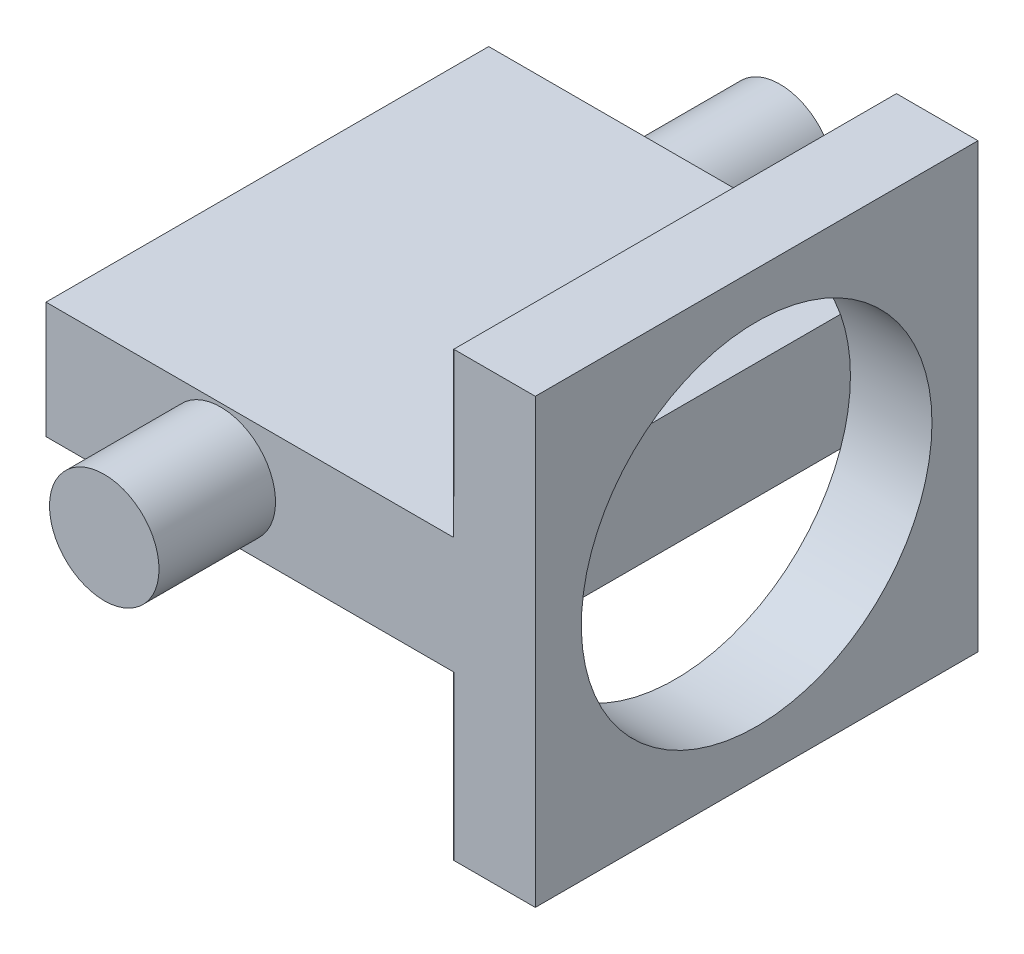
ISO-10303-21;
HEADER;
FILE_DESCRIPTION(('STEP AP214'),'2;1');
FILE_NAME('part.step','',(''),(''),'','','');
FILE_SCHEMA(('AUTOMOTIVE_DESIGN { 1 0 10303 214 1 1 1 1 }'));
ENDSEC;
DATA;
#1=APPLICATION_CONTEXT('core data for automotive mechanical design processes');
#2=APPLICATION_PROTOCOL_DEFINITION('international standard','automotive_design',2000,#1);
#3=PRODUCT_CONTEXT('',#1,'mechanical');
#4=PRODUCT('Part','Part','',(#3));
#5=PRODUCT_RELATED_PRODUCT_CATEGORY('part','',(#4));
#6=PRODUCT_DEFINITION_FORMATION('','',#4);
#7=PRODUCT_DEFINITION_CONTEXT('part definition',#1,'design');
#8=PRODUCT_DEFINITION('design','',#6,#7);
#9=PRODUCT_DEFINITION_SHAPE('','',#8);
#10=(LENGTH_UNIT() NAMED_UNIT(*) SI_UNIT(.MILLI.,.METRE.));
#11=(NAMED_UNIT(*) PLANE_ANGLE_UNIT() SI_UNIT($,.RADIAN.));
#12=(NAMED_UNIT(*) SI_UNIT($,.STERADIAN.) SOLID_ANGLE_UNIT());
#13=UNCERTAINTY_MEASURE_WITH_UNIT(LENGTH_MEASURE(1.E-05),#10,'distance_accuracy_value','');
#14=(GEOMETRIC_REPRESENTATION_CONTEXT(3) GLOBAL_UNCERTAINTY_ASSIGNED_CONTEXT((#13)) GLOBAL_UNIT_ASSIGNED_CONTEXT((#10,
#11,#12)) REPRESENTATION_CONTEXT('',''));
#15=CARTESIAN_POINT('',(0.,0.,0.));
#16=DIRECTION('',(0.,0.,1.));
#17=DIRECTION('',(1.,0.,0.));
#18=AXIS2_PLACEMENT_3D('',#15,#16,#17);
#19=CARTESIAN_POINT('',(0.,0.,0.));
#20=DIRECTION('',(-1.,0.,0.));
#21=DIRECTION('',(0.,0.,1.));
#22=AXIS2_PLACEMENT_3D('',#19,#20,#21);
#23=PLANE('',#22);
#24=DIRECTION('',(0.,0.,1.));
#25=VECTOR('',#24,1.);
#26=CARTESIAN_POINT('',(0.,-5.,-19.));
#27=LINE('',#26,#25);
#28=CARTESIAN_POINT('',(0.,-5.,-19.));
#29=VERTEX_POINT('',#28);
#30=CARTESIAN_POINT('',(0.,-5.,-14.1951576250495));
#31=VERTEX_POINT('',#30);
#32=EDGE_CURVE('E146',#29,#31,#27,.T.);
#33=ORIENTED_EDGE('',*,*,#32,.F.);
#34=DIRECTION('',(0.,1.,0.));
#35=VECTOR('',#34,1.);
#36=CARTESIAN_POINT('',(0.,-19.,-19.));
#37=LINE('',#36,#35);
#38=CARTESIAN_POINT('',(0.,-19.,-19.));
#39=VERTEX_POINT('',#38);
#40=EDGE_CURVE('E186',#39,#29,#37,.T.);
#41=ORIENTED_EDGE('',*,*,#40,.F.);
#42=DIRECTION('',(0.,0.,-1.));
#43=VECTOR('',#42,1.);
#44=CARTESIAN_POINT('',(0.,-19.,19.));
#45=LINE('',#44,#43);
#46=CARTESIAN_POINT('',(0.,-19.,19.));
#47=VERTEX_POINT('',#46);
#48=EDGE_CURVE('E176',#47,#39,#45,.T.);
#49=ORIENTED_EDGE('',*,*,#48,.F.);
#50=DIRECTION('',(0.,-1.,0.));
#51=VECTOR('',#50,1.);
#52=CARTESIAN_POINT('',(0.,-19.,19.));
#53=LINE('',#52,#51);
#54=CARTESIAN_POINT('',(0.,-5.,19.));
#55=VERTEX_POINT('',#54);
#56=EDGE_CURVE('E193',#55,#47,#53,.T.);
#57=ORIENTED_EDGE('',*,*,#56,.F.);
#58=CARTESIAN_POINT('',(0.,-5.,14.1951576250495));
#59=VERTEX_POINT('',#58);
#60=EDGE_CURVE('E54',#59,#55,#27,.T.);
#61=ORIENTED_EDGE('',*,*,#60,.F.);
#62=CARTESIAN_POINT('',(0.,0.,0.));
#63=DIRECTION('',(1.,0.,0.));
#64=DIRECTION('',(0.,0.,-1.));
#65=AXIS2_PLACEMENT_3D('',#62,#63,#64);
#66=CIRCLE('',#65,15.05);
#67=EDGE_CURVE('E157',#59,#31,#66,.T.);
#68=ORIENTED_EDGE('',*,*,#67,.T.);
#69=EDGE_LOOP('',(#33,#41,#49,#57,#61,#68));
#70=FACE_BOUND('',#69,.T.);
#71=ADVANCED_FACE('F45',(#70),#23,.T.);
#72=CARTESIAN_POINT('',(7.,0.,0.));
#73=DIRECTION('',(-1.,0.,0.));
#74=DIRECTION('',(0.,0.,1.));
#75=AXIS2_PLACEMENT_3D('',#72,#73,#74);
#76=PLANE('',#75);
#77=DIRECTION('',(0.,1.,0.));
#78=VECTOR('',#77,1.);
#79=CARTESIAN_POINT('',(7.,-19.,-19.));
#80=LINE('',#79,#78);
#81=CARTESIAN_POINT('',(7.,-19.,-19.));
#82=VERTEX_POINT('',#81);
#83=CARTESIAN_POINT('',(7.,19.,-19.));
#84=VERTEX_POINT('',#83);
#85=EDGE_CURVE('E171',#82,#84,#80,.T.);
#86=ORIENTED_EDGE('',*,*,#85,.T.);
#87=DIRECTION('',(0.,0.,1.));
#88=VECTOR('',#87,1.);
#89=CARTESIAN_POINT('',(7.,19.,19.));
#90=LINE('',#89,#88);
#91=CARTESIAN_POINT('',(7.,19.,19.));
#92=VERTEX_POINT('',#91);
#93=EDGE_CURVE('E175',#84,#92,#90,.T.);
#94=ORIENTED_EDGE('',*,*,#93,.T.);
#95=DIRECTION('',(0.,-1.,0.));
#96=VECTOR('',#95,1.);
#97=CARTESIAN_POINT('',(7.,-19.,19.));
#98=LINE('',#97,#96);
#99=CARTESIAN_POINT('',(7.,-19.,19.));
#100=VERTEX_POINT('',#99);
#101=EDGE_CURVE('E179',#92,#100,#98,.T.);
#102=ORIENTED_EDGE('',*,*,#101,.T.);
#103=DIRECTION('',(0.,0.,-1.));
#104=VECTOR('',#103,1.);
#105=CARTESIAN_POINT('',(7.,-19.,19.));
#106=LINE('',#105,#104);
#107=EDGE_CURVE('E182',#100,#82,#106,.T.);
#108=ORIENTED_EDGE('',*,*,#107,.T.);
#109=EDGE_LOOP('',(#86,#94,#102,#108));
#110=FACE_BOUND('',#109,.T.);
#111=CARTESIAN_POINT('',(7.,0.,0.));
#112=DIRECTION('',(1.,0.,0.));
#113=DIRECTION('',(0.,0.,-1.));
#114=AXIS2_PLACEMENT_3D('',#111,#112,#113);
#115=CIRCLE('',#114,15.05);
#116=CARTESIAN_POINT('',(7.,0.,-15.05));
#117=VERTEX_POINT('',#116);
#118=EDGE_CURVE('E164',#117,#117,#115,.T.);
#119=ORIENTED_EDGE('',*,*,#118,.F.);
#120=EDGE_LOOP('',(#119));
#121=FACE_BOUND('',#120,.T.);
#122=ADVANCED_FACE('F274',(#110,#121),#76,.F.);
#123=DIRECTION('',(0.,0.,-1.));
#124=VECTOR('',#123,1.);
#125=CARTESIAN_POINT('',(0.,5.,-19.));
#126=LINE('',#125,#124);
#127=CARTESIAN_POINT('',(0.,5.,19.));
#128=VERTEX_POINT('',#127);
#129=CARTESIAN_POINT('',(0.,5.,14.1951576250495));
#130=VERTEX_POINT('',#129);
#131=EDGE_CURVE('E215',#128,#130,#126,.T.);
#132=ORIENTED_EDGE('',*,*,#131,.F.);
#133=CARTESIAN_POINT('',(0.,19.,19.));
#134=VERTEX_POINT('',#133);
#135=EDGE_CURVE('E152',#134,#128,#53,.T.);
#136=ORIENTED_EDGE('',*,*,#135,.F.);
#137=DIRECTION('',(0.,0.,1.));
#138=VECTOR('',#137,1.);
#139=CARTESIAN_POINT('',(0.,19.,19.));
#140=LINE('',#139,#138);
#141=CARTESIAN_POINT('',(0.,19.,-19.));
#142=VERTEX_POINT('',#141);
#143=EDGE_CURVE('E190',#142,#134,#140,.T.);
#144=ORIENTED_EDGE('',*,*,#143,.F.);
#145=CARTESIAN_POINT('',(0.,5.,-19.));
#146=VERTEX_POINT('',#145);
#147=EDGE_CURVE('E167',#146,#142,#37,.T.);
#148=ORIENTED_EDGE('',*,*,#147,.F.);
#149=CARTESIAN_POINT('',(0.,5.,-14.1951576250495));
#150=VERTEX_POINT('',#149);
#151=EDGE_CURVE('E210',#150,#146,#126,.T.);
#152=ORIENTED_EDGE('',*,*,#151,.F.);
#153=EDGE_CURVE('E159',#150,#130,#66,.T.);
#154=ORIENTED_EDGE('',*,*,#153,.T.);
#155=EDGE_LOOP('',(#132,#136,#144,#148,#152,#154));
#156=FACE_BOUND('',#155,.T.);
#157=ADVANCED_FACE('F276',(#156),#23,.T.);
#158=CARTESIAN_POINT('',(7.,-19.,-19.));
#159=DIRECTION('',(0.,0.,1.));
#160=DIRECTION('',(1.,0.,0.));
#161=AXIS2_PLACEMENT_3D('',#158,#159,#160);
#162=PLANE('',#161);
#163=CARTESIAN_POINT('',(-20.,0.,-19.));
#164=DIRECTION('',(0.,0.,1.));
#165=DIRECTION('',(1.,0.,0.));
#166=AXIS2_PLACEMENT_3D('',#163,#164,#165);
#167=CIRCLE('',#166,4.7);
#168=CARTESIAN_POINT('',(-15.3,0.,-19.));
#169=VERTEX_POINT('',#168);
#170=EDGE_CURVE('E234',#169,#169,#167,.T.);
#171=ORIENTED_EDGE('',*,*,#170,.T.);
#172=EDGE_LOOP('',(#171));
#173=FACE_BOUND('',#172,.T.);
#174=ORIENTED_EDGE('',*,*,#40,.T.);
#175=DIRECTION('',(1.,0.,0.));
#176=VECTOR('',#175,1.);
#177=CARTESIAN_POINT('',(-35.,-5.,-19.));
#178=LINE('',#177,#176);
#179=CARTESIAN_POINT('',(-35.,-5.,-19.));
#180=VERTEX_POINT('',#179);
#181=EDGE_CURVE('E160',#180,#29,#178,.T.);
#182=ORIENTED_EDGE('',*,*,#181,.F.);
#183=DIRECTION('',(0.,-1.,0.));
#184=VECTOR('',#183,1.);
#185=CARTESIAN_POINT('',(-35.,-5.,-19.));
#186=LINE('',#185,#184);
#187=CARTESIAN_POINT('',(-35.,5.,-19.));
#188=VERTEX_POINT('',#187);
#189=EDGE_CURVE('E135',#188,#180,#186,.T.);
#190=ORIENTED_EDGE('',*,*,#189,.F.);
#191=DIRECTION('',(1.,0.,0.));
#192=VECTOR('',#191,1.);
#193=CARTESIAN_POINT('',(-35.,5.,-19.));
#194=LINE('',#193,#192);
#195=EDGE_CURVE('E131',#188,#146,#194,.T.);
#196=ORIENTED_EDGE('',*,*,#195,.T.);
#197=ORIENTED_EDGE('',*,*,#147,.T.);
#198=DIRECTION('',(-1.,0.,0.));
#199=VECTOR('',#198,1.);
#200=CARTESIAN_POINT('',(7.,19.,-19.));
#201=LINE('',#200,#199);
#202=EDGE_CURVE('E207',#84,#142,#201,.T.);
#203=ORIENTED_EDGE('',*,*,#202,.F.);
#204=ORIENTED_EDGE('',*,*,#85,.F.);
#205=DIRECTION('',(-1.,0.,0.));
#206=VECTOR('',#205,1.);
#207=CARTESIAN_POINT('',(7.,-19.,-19.));
#208=LINE('',#207,#206);
#209=EDGE_CURVE('E185',#82,#39,#208,.T.);
#210=ORIENTED_EDGE('',*,*,#209,.T.);
#211=EDGE_LOOP('',(#174,#182,#190,#196,#197,#203,#204,#210));
#212=FACE_BOUND('',#211,.T.);
#213=ADVANCED_FACE('F47',(#173,#212),#162,.F.);
#214=CARTESIAN_POINT('',(7.,19.,19.));
#215=DIRECTION('',(0.,-1.,0.));
#216=DIRECTION('',(0.,0.,-1.));
#217=AXIS2_PLACEMENT_3D('',#214,#215,#216);
#218=PLANE('',#217);
#219=ORIENTED_EDGE('',*,*,#143,.T.);
#220=DIRECTION('',(-1.,0.,0.));
#221=VECTOR('',#220,1.);
#222=CARTESIAN_POINT('',(7.,19.,19.));
#223=LINE('',#222,#221);
#224=EDGE_CURVE('E205',#92,#134,#223,.T.);
#225=ORIENTED_EDGE('',*,*,#224,.F.);
#226=ORIENTED_EDGE('',*,*,#93,.F.);
#227=ORIENTED_EDGE('',*,*,#202,.T.);
#228=EDGE_LOOP('',(#219,#225,#226,#227));
#229=FACE_BOUND('',#228,.T.);
#230=ADVANCED_FACE('F285',(#229),#218,.F.);
#231=CARTESIAN_POINT('',(7.,-19.,19.));
#232=DIRECTION('',(0.,0.,-1.));
#233=DIRECTION('',(-1.,0.,0.));
#234=AXIS2_PLACEMENT_3D('',#231,#232,#233);
#235=PLANE('',#234);
#236=CARTESIAN_POINT('',(-20.,0.,19.));
#237=DIRECTION('',(0.,0.,-1.));
#238=DIRECTION('',(-1.,0.,0.));
#239=AXIS2_PLACEMENT_3D('',#236,#237,#238);
#240=CIRCLE('',#239,4.7);
#241=CARTESIAN_POINT('',(-24.7,0.,19.));
#242=VERTEX_POINT('',#241);
#243=EDGE_CURVE('E11',#242,#242,#240,.F.);
#244=ORIENTED_EDGE('',*,*,#243,.F.);
#245=EDGE_LOOP('',(#244));
#246=FACE_BOUND('',#245,.T.);
#247=ORIENTED_EDGE('',*,*,#135,.T.);
#248=DIRECTION('',(1.,0.,0.));
#249=VECTOR('',#248,1.);
#250=CARTESIAN_POINT('',(-35.,5.,19.));
#251=LINE('',#250,#249);
#252=CARTESIAN_POINT('',(-35.,5.,19.));
#253=VERTEX_POINT('',#252);
#254=EDGE_CURVE('E128',#253,#128,#251,.T.);
#255=ORIENTED_EDGE('',*,*,#254,.F.);
#256=DIRECTION('',(0.,1.,0.));
#257=VECTOR('',#256,1.);
#258=CARTESIAN_POINT('',(-35.,-5.,19.));
#259=LINE('',#258,#257);
#260=CARTESIAN_POINT('',(-35.,-5.,19.));
#261=VERTEX_POINT('',#260);
#262=EDGE_CURVE('E136',#261,#253,#259,.T.);
#263=ORIENTED_EDGE('',*,*,#262,.F.);
#264=DIRECTION('',(1.,0.,0.));
#265=VECTOR('',#264,1.);
#266=CARTESIAN_POINT('',(-35.,-5.,19.));
#267=LINE('',#266,#265);
#268=EDGE_CURVE('E240',#261,#55,#267,.T.);
#269=ORIENTED_EDGE('',*,*,#268,.T.);
#270=ORIENTED_EDGE('',*,*,#56,.T.);
#271=DIRECTION('',(-1.,0.,0.));
#272=VECTOR('',#271,1.);
#273=CARTESIAN_POINT('',(7.,-19.,19.));
#274=LINE('',#273,#272);
#275=EDGE_CURVE('E201',#100,#47,#274,.T.);
#276=ORIENTED_EDGE('',*,*,#275,.F.);
#277=ORIENTED_EDGE('',*,*,#101,.F.);
#278=ORIENTED_EDGE('',*,*,#224,.T.);
#279=EDGE_LOOP('',(#247,#255,#263,#269,#270,#276,#277,#278));
#280=FACE_BOUND('',#279,.T.);
#281=ADVANCED_FACE('F149',(#246,#280),#235,.F.);
#282=CARTESIAN_POINT('',(7.,-19.,19.));
#283=DIRECTION('',(0.,1.,0.));
#284=DIRECTION('',(0.,0.,1.));
#285=AXIS2_PLACEMENT_3D('',#282,#283,#284);
#286=PLANE('',#285);
#287=ORIENTED_EDGE('',*,*,#48,.T.);
#288=ORIENTED_EDGE('',*,*,#209,.F.);
#289=ORIENTED_EDGE('',*,*,#107,.F.);
#290=ORIENTED_EDGE('',*,*,#275,.T.);
#291=EDGE_LOOP('',(#287,#288,#289,#290));
#292=FACE_BOUND('',#291,.T.);
#293=ADVANCED_FACE('F261',(#292),#286,.F.);
#294=CARTESIAN_POINT('',(7.,0.,0.));
#295=DIRECTION('',(-1.,0.,0.));
#296=DIRECTION('',(0.,0.,1.));
#297=AXIS2_PLACEMENT_3D('',#294,#295,#296);
#298=CYLINDRICAL_SURFACE('',#297,15.05);
#299=ORIENTED_EDGE('',*,*,#118,.T.);
#300=EDGE_LOOP('',(#299));
#301=FACE_BOUND('',#300,.T.);
#302=ORIENTED_EDGE('',*,*,#153,.F.);
#303=EDGE_CURVE('E61',#31,#150,#66,.T.);
#304=ORIENTED_EDGE('',*,*,#303,.F.);
#305=ORIENTED_EDGE('',*,*,#67,.F.);
#306=EDGE_CURVE('E170',#130,#59,#66,.T.);
#307=ORIENTED_EDGE('',*,*,#306,.F.);
#308=EDGE_LOOP('',(#302,#304,#305,#307));
#309=FACE_BOUND('',#308,.T.);
#310=ADVANCED_FACE('F259',(#301,#309),#298,.F.);
#311=CARTESIAN_POINT('',(-35.,5.,-19.));
#312=DIRECTION('',(0.,-1.,0.));
#313=DIRECTION('',(0.,0.,-1.));
#314=AXIS2_PLACEMENT_3D('',#311,#312,#313);
#315=PLANE('',#314);
#316=ORIENTED_EDGE('',*,*,#131,.T.);
#317=EDGE_CURVE('E216',#130,#150,#126,.T.);
#318=ORIENTED_EDGE('',*,*,#317,.T.);
#319=ORIENTED_EDGE('',*,*,#151,.T.);
#320=ORIENTED_EDGE('',*,*,#195,.F.);
#321=DIRECTION('',(0.,0.,-1.));
#322=VECTOR('',#321,1.);
#323=CARTESIAN_POINT('',(-35.,5.,-19.));
#324=LINE('',#323,#322);
#325=EDGE_CURVE('E123',#253,#188,#324,.T.);
#326=ORIENTED_EDGE('',*,*,#325,.F.);
#327=ORIENTED_EDGE('',*,*,#254,.T.);
#328=EDGE_LOOP('',(#316,#318,#319,#320,#326,#327));
#329=FACE_BOUND('',#328,.T.);
#330=ADVANCED_FACE('F126',(#329),#315,.F.);
#331=CARTESIAN_POINT('',(-35.,-5.,-19.));
#332=DIRECTION('',(0.,1.,0.));
#333=DIRECTION('',(0.,0.,1.));
#334=AXIS2_PLACEMENT_3D('',#331,#332,#333);
#335=PLANE('',#334);
#336=ORIENTED_EDGE('',*,*,#32,.T.);
#337=EDGE_CURVE('E220',#31,#59,#27,.T.);
#338=ORIENTED_EDGE('',*,*,#337,.T.);
#339=ORIENTED_EDGE('',*,*,#60,.T.);
#340=ORIENTED_EDGE('',*,*,#268,.F.);
#341=DIRECTION('',(0.,0.,1.));
#342=VECTOR('',#341,1.);
#343=CARTESIAN_POINT('',(-35.,-5.,-19.));
#344=LINE('',#343,#342);
#345=EDGE_CURVE('E141',#180,#261,#344,.T.);
#346=ORIENTED_EDGE('',*,*,#345,.F.);
#347=ORIENTED_EDGE('',*,*,#181,.T.);
#348=EDGE_LOOP('',(#336,#338,#339,#340,#346,#347));
#349=FACE_BOUND('',#348,.T.);
#350=ADVANCED_FACE('F251',(#349),#335,.F.);
#351=CARTESIAN_POINT('',(-35.,0.,0.));
#352=DIRECTION('',(1.,0.,0.));
#353=DIRECTION('',(0.,0.,-1.));
#354=AXIS2_PLACEMENT_3D('',#351,#352,#353);
#355=PLANE('',#354);
#356=ORIENTED_EDGE('',*,*,#262,.T.);
#357=ORIENTED_EDGE('',*,*,#325,.T.);
#358=ORIENTED_EDGE('',*,*,#189,.T.);
#359=ORIENTED_EDGE('',*,*,#345,.T.);
#360=EDGE_LOOP('',(#356,#357,#358,#359));
#361=FACE_BOUND('',#360,.T.);
#362=ADVANCED_FACE('F139',(#361),#355,.F.);
#363=CARTESIAN_POINT('',(0.,0.,0.));
#364=DIRECTION('',(1.,0.,0.));
#365=DIRECTION('',(0.,0.,-1.));
#366=AXIS2_PLACEMENT_3D('',#363,#364,#365);
#367=PLANE('',#366);
#368=ORIENTED_EDGE('',*,*,#317,.F.);
#369=ORIENTED_EDGE('',*,*,#306,.T.);
#370=ORIENTED_EDGE('',*,*,#337,.F.);
#371=ORIENTED_EDGE('',*,*,#303,.T.);
#372=EDGE_LOOP('',(#368,#369,#370,#371));
#373=FACE_BOUND('',#372,.T.);
#374=ADVANCED_FACE('F254',(#373),#367,.T.);
#375=CARTESIAN_POINT('',(-20.,0.,29.));
#376=DIRECTION('',(0.,0.,-1.));
#377=DIRECTION('',(-1.,0.,0.));
#378=AXIS2_PLACEMENT_3D('',#375,#376,#377);
#379=CYLINDRICAL_SURFACE('',#378,4.7);
#380=CARTESIAN_POINT('',(-20.,0.,29.));
#381=DIRECTION('',(0.,0.,1.));
#382=DIRECTION('',(1.,0.,0.));
#383=AXIS2_PLACEMENT_3D('',#380,#381,#382);
#384=CIRCLE('',#383,4.7);
#385=CARTESIAN_POINT('',(-15.3,0.,29.));
#386=VERTEX_POINT('',#385);
#387=EDGE_CURVE('E224',#386,#386,#384,.T.);
#388=ORIENTED_EDGE('',*,*,#387,.F.);
#389=EDGE_LOOP('',(#388));
#390=FACE_BOUND('',#389,.T.);
#391=ORIENTED_EDGE('',*,*,#243,.T.);
#392=EDGE_LOOP('',(#391));
#393=FACE_BOUND('',#392,.T.);
#394=ADVANCED_FACE('F312',(#390,#393),#379,.T.);
#395=CARTESIAN_POINT('',(-20.,0.,29.));
#396=DIRECTION('',(0.,0.,1.));
#397=DIRECTION('',(1.,0.,0.));
#398=AXIS2_PLACEMENT_3D('',#395,#396,#397);
#399=PLANE('',#398);
#400=ORIENTED_EDGE('',*,*,#387,.T.);
#401=EDGE_LOOP('',(#400));
#402=FACE_BOUND('',#401,.T.);
#403=ADVANCED_FACE('F313',(#402),#399,.T.);
#404=CARTESIAN_POINT('',(-20.,0.,-29.));
#405=DIRECTION('',(0.,0.,1.));
#406=DIRECTION('',(1.,0.,0.));
#407=AXIS2_PLACEMENT_3D('',#404,#405,#406);
#408=CYLINDRICAL_SURFACE('',#407,4.7);
#409=CARTESIAN_POINT('',(-20.,0.,-29.));
#410=DIRECTION('',(0.,0.,1.));
#411=DIRECTION('',(1.,0.,0.));
#412=AXIS2_PLACEMENT_3D('',#409,#410,#411);
#413=CIRCLE('',#412,4.7);
#414=CARTESIAN_POINT('',(-15.3,0.,-29.));
#415=VERTEX_POINT('',#414);
#416=EDGE_CURVE('E228',#415,#415,#413,.T.);
#417=ORIENTED_EDGE('',*,*,#416,.T.);
#418=EDGE_LOOP('',(#417));
#419=FACE_BOUND('',#418,.T.);
#420=ORIENTED_EDGE('',*,*,#170,.F.);
#421=EDGE_LOOP('',(#420));
#422=FACE_BOUND('',#421,.T.);
#423=ADVANCED_FACE('F319',(#419,#422),#408,.T.);
#424=CARTESIAN_POINT('',(-20.,0.,-29.));
#425=DIRECTION('',(0.,0.,-1.));
#426=DIRECTION('',(1.,0.,0.));
#427=AXIS2_PLACEMENT_3D('',#424,#425,#426);
#428=PLANE('',#427);
#429=ORIENTED_EDGE('',*,*,#416,.F.);
#430=EDGE_LOOP('',(#429));
#431=FACE_BOUND('',#430,.T.);
#432=ADVANCED_FACE('F361',(#431),#428,.T.);
#433=CLOSED_SHELL('',(#71,#122,#157,#213,#230,#281,#293,#310,#330,#350,#362,#374,#394,#403,#423,#432));
#434=MANIFOLD_SOLID_BREP('B2',#433);
#435=ADVANCED_BREP_SHAPE_REPRESENTATION('',(#18,#434),#14);
#436=SHAPE_DEFINITION_REPRESENTATION(#9,#435);
ENDSEC;
END-ISO-10303-21;
